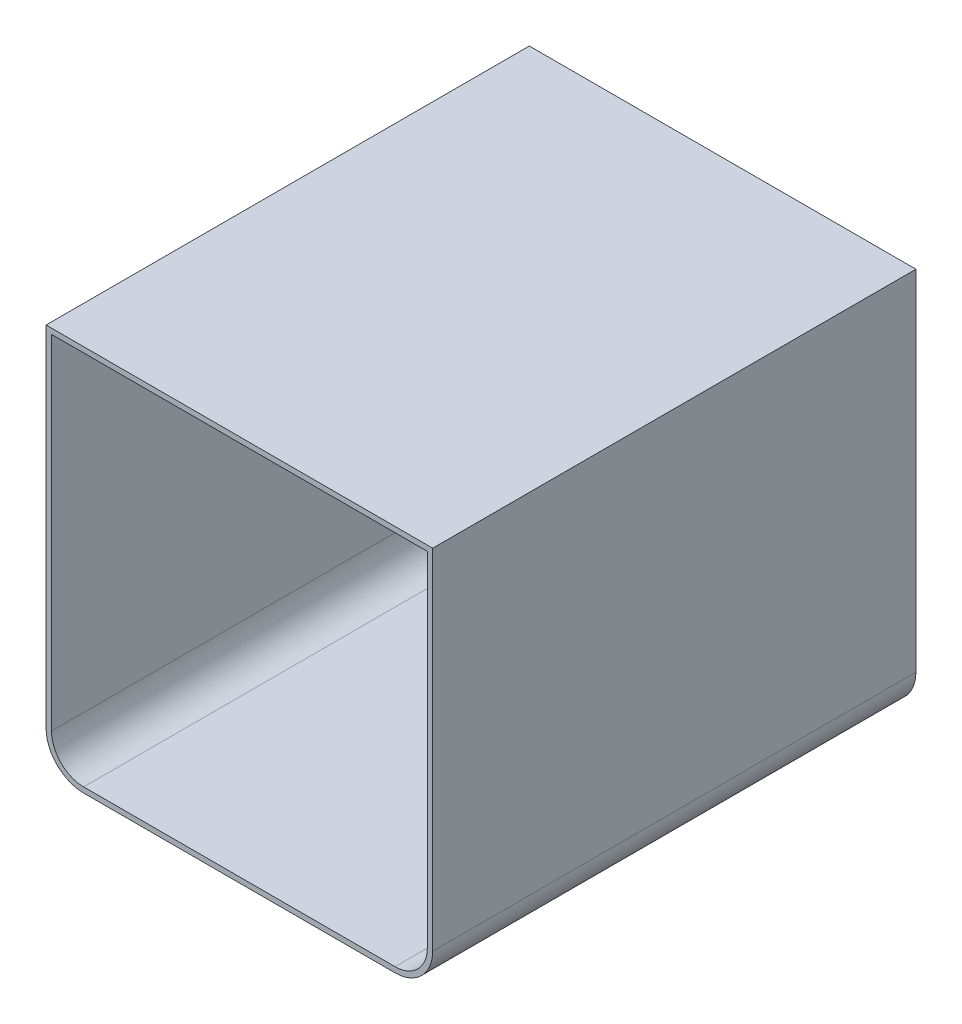
ISO-10303-21;
HEADER;
FILE_DESCRIPTION(('STEP AP214'),'2;1');
FILE_NAME('part.step','',(''),(''),'','','');
FILE_SCHEMA(('AUTOMOTIVE_DESIGN { 1 0 10303 214 1 1 1 1 }'));
ENDSEC;
DATA;
#1=APPLICATION_CONTEXT('core data for automotive mechanical design processes');
#2=APPLICATION_PROTOCOL_DEFINITION('international standard','automotive_design',2000,#1);
#3=PRODUCT_CONTEXT('',#1,'mechanical');
#4=PRODUCT('Part','Part','',(#3));
#5=PRODUCT_RELATED_PRODUCT_CATEGORY('part','',(#4));
#6=PRODUCT_DEFINITION_FORMATION('','',#4);
#7=PRODUCT_DEFINITION_CONTEXT('part definition',#1,'design');
#8=PRODUCT_DEFINITION('design','',#6,#7);
#9=PRODUCT_DEFINITION_SHAPE('','',#8);
#10=(LENGTH_UNIT() NAMED_UNIT(*) SI_UNIT(.MILLI.,.METRE.));
#11=(NAMED_UNIT(*) PLANE_ANGLE_UNIT() SI_UNIT($,.RADIAN.));
#12=(NAMED_UNIT(*) SI_UNIT($,.STERADIAN.) SOLID_ANGLE_UNIT());
#13=UNCERTAINTY_MEASURE_WITH_UNIT(LENGTH_MEASURE(1.E-05),#10,'distance_accuracy_value','');
#14=(GEOMETRIC_REPRESENTATION_CONTEXT(3) GLOBAL_UNCERTAINTY_ASSIGNED_CONTEXT((#13)) GLOBAL_UNIT_ASSIGNED_CONTEXT((#10,
#11,#12)) REPRESENTATION_CONTEXT('',''));
#15=CARTESIAN_POINT('',(0.,0.,0.));
#16=DIRECTION('',(0.,0.,1.));
#17=DIRECTION('',(1.,0.,0.));
#18=AXIS2_PLACEMENT_3D('',#15,#16,#17);
#19=CARTESIAN_POINT('',(-58.,-58.,180.));
#20=DIRECTION('',(0.,0.,-1.));
#21=DIRECTION('',(-1.,0.,0.));
#22=AXIS2_PLACEMENT_3D('',#19,#20,#21);
#23=PLANE('',#22);
#24=DIRECTION('',(0.,1.,0.));
#25=VECTOR('',#24,1.);
#26=CARTESIAN_POINT('',(72.,-57.9999999999999,180.));
#27=LINE('',#26,#25);
#28=CARTESIAN_POINT('',(72.,-58.,180.));
#29=VERTEX_POINT('',#28);
#30=CARTESIAN_POINT('',(72.,72.,180.));
#31=VERTEX_POINT('',#30);
#32=EDGE_CURVE('E177',#29,#31,#27,.T.);
#33=ORIENTED_EDGE('',*,*,#32,.T.);
#34=DIRECTION('',(-1.,0.,0.));
#35=VECTOR('',#34,1.);
#36=CARTESIAN_POINT('',(-72.,72.,180.));
#37=LINE('',#36,#35);
#38=CARTESIAN_POINT('',(-72.,72.,180.));
#39=VERTEX_POINT('',#38);
#40=EDGE_CURVE('E180',#31,#39,#37,.T.);
#41=ORIENTED_EDGE('',*,*,#40,.T.);
#42=DIRECTION('',(0.,-1.,0.));
#43=VECTOR('',#42,1.);
#44=CARTESIAN_POINT('',(-72.,-57.9999999999999,180.));
#45=LINE('',#44,#43);
#46=CARTESIAN_POINT('',(-72.,-57.9999999999999,180.));
#47=VERTEX_POINT('',#46);
#48=EDGE_CURVE('E183',#39,#47,#45,.T.);
#49=ORIENTED_EDGE('',*,*,#48,.T.);
#50=CARTESIAN_POINT('',(-58.,-58.,180.));
#51=DIRECTION('',(0.,0.,1.));
#52=DIRECTION('',(-1.,0.,0.));
#53=AXIS2_PLACEMENT_3D('',#50,#51,#52);
#54=CIRCLE('',#53,14.);
#55=CARTESIAN_POINT('',(-57.9999999999999,-72.,180.));
#56=VERTEX_POINT('',#55);
#57=EDGE_CURVE('E185',#47,#56,#54,.T.);
#58=ORIENTED_EDGE('',*,*,#57,.T.);
#59=DIRECTION('',(1.,0.,0.));
#60=VECTOR('',#59,1.);
#61=CARTESIAN_POINT('',(-57.9999999999999,-72.,180.));
#62=LINE('',#61,#60);
#63=CARTESIAN_POINT('',(57.9999999999999,-72.,180.));
#64=VERTEX_POINT('',#63);
#65=EDGE_CURVE('E187',#56,#64,#62,.T.);
#66=ORIENTED_EDGE('',*,*,#65,.T.);
#67=CARTESIAN_POINT('',(58.,-58.,180.));
#68=DIRECTION('',(0.,0.,1.));
#69=DIRECTION('',(1.,0.,0.));
#70=AXIS2_PLACEMENT_3D('',#67,#68,#69);
#71=CIRCLE('',#70,14.);
#72=EDGE_CURVE('E189',#64,#29,#71,.T.);
#73=ORIENTED_EDGE('',*,*,#72,.T.);
#74=EDGE_LOOP('',(#33,#41,#49,#58,#66,#73));
#75=FACE_BOUND('',#74,.T.);
#76=CARTESIAN_POINT('',(-58.,-58.,180.));
#77=DIRECTION('',(0.,0.,1.));
#78=DIRECTION('',(-1.,0.,0.));
#79=AXIS2_PLACEMENT_3D('',#76,#77,#78);
#80=CIRCLE('',#79,12.);
#81=CARTESIAN_POINT('',(-70.,-57.9999999999999,180.));
#82=VERTEX_POINT('',#81);
#83=CARTESIAN_POINT('',(-57.9999999999999,-70.,180.));
#84=VERTEX_POINT('',#83);
#85=EDGE_CURVE('E126',#82,#84,#80,.T.);
#86=ORIENTED_EDGE('',*,*,#85,.F.);
#87=DIRECTION('',(0.,-1.,0.));
#88=VECTOR('',#87,1.);
#89=CARTESIAN_POINT('',(-70.,-57.9999999999999,180.));
#90=LINE('',#89,#88);
#91=CARTESIAN_POINT('',(-70.,70.,180.));
#92=VERTEX_POINT('',#91);
#93=EDGE_CURVE('E155',#92,#82,#90,.T.);
#94=ORIENTED_EDGE('',*,*,#93,.F.);
#95=DIRECTION('',(-1.,0.,0.));
#96=VECTOR('',#95,1.);
#97=CARTESIAN_POINT('',(-70.,70.,180.));
#98=LINE('',#97,#96);
#99=CARTESIAN_POINT('',(70.,70.,180.));
#100=VERTEX_POINT('',#99);
#101=EDGE_CURVE('E153',#100,#92,#98,.T.);
#102=ORIENTED_EDGE('',*,*,#101,.F.);
#103=DIRECTION('',(0.,1.,0.));
#104=VECTOR('',#103,1.);
#105=CARTESIAN_POINT('',(70.,-57.9999999999999,180.));
#106=LINE('',#105,#104);
#107=CARTESIAN_POINT('',(70.,-57.9999999999999,180.));
#108=VERTEX_POINT('',#107);
#109=EDGE_CURVE('E149',#108,#100,#106,.T.);
#110=ORIENTED_EDGE('',*,*,#109,.F.);
#111=CARTESIAN_POINT('',(58.,-58.,180.));
#112=DIRECTION('',(0.,0.,1.));
#113=DIRECTION('',(1.,0.,0.));
#114=AXIS2_PLACEMENT_3D('',#111,#112,#113);
#115=CIRCLE('',#114,12.);
#116=CARTESIAN_POINT('',(57.9999999999999,-70.,180.));
#117=VERTEX_POINT('',#116);
#118=EDGE_CURVE('E147',#117,#108,#115,.T.);
#119=ORIENTED_EDGE('',*,*,#118,.F.);
#120=DIRECTION('',(1.,0.,0.));
#121=VECTOR('',#120,1.);
#122=CARTESIAN_POINT('',(-57.9999999999999,-70.,180.));
#123=LINE('',#122,#121);
#124=EDGE_CURVE('E134',#84,#117,#123,.T.);
#125=ORIENTED_EDGE('',*,*,#124,.F.);
#126=EDGE_LOOP('',(#86,#94,#102,#110,#119,#125));
#127=FACE_BOUND('',#126,.T.);
#128=ADVANCED_FACE('F37',(#75,#127),#23,.F.);
#129=CARTESIAN_POINT('',(-58.,-58.,0.));
#130=DIRECTION('',(0.,0.,-1.));
#131=DIRECTION('',(-1.,0.,0.));
#132=AXIS2_PLACEMENT_3D('',#129,#130,#131);
#133=PLANE('',#132);
#134=DIRECTION('',(0.,1.,0.));
#135=VECTOR('',#134,1.);
#136=CARTESIAN_POINT('',(72.,-57.9999999999999,0.));
#137=LINE('',#136,#135);
#138=CARTESIAN_POINT('',(72.,-58.,0.));
#139=VERTEX_POINT('',#138);
#140=CARTESIAN_POINT('',(72.,72.,0.));
#141=VERTEX_POINT('',#140);
#142=EDGE_CURVE('E142',#139,#141,#137,.T.);
#143=ORIENTED_EDGE('',*,*,#142,.F.);
#144=CARTESIAN_POINT('',(58.,-58.,0.));
#145=DIRECTION('',(0.,0.,1.));
#146=DIRECTION('',(1.,0.,0.));
#147=AXIS2_PLACEMENT_3D('',#144,#145,#146);
#148=CIRCLE('',#147,14.);
#149=CARTESIAN_POINT('',(57.9999999999999,-72.,0.));
#150=VERTEX_POINT('',#149);
#151=EDGE_CURVE('E181',#150,#139,#148,.T.);
#152=ORIENTED_EDGE('',*,*,#151,.F.);
#153=DIRECTION('',(1.,0.,0.));
#154=VECTOR('',#153,1.);
#155=CARTESIAN_POINT('',(-57.9999999999999,-72.,0.));
#156=LINE('',#155,#154);
#157=CARTESIAN_POINT('',(-57.9999999999999,-72.,0.));
#158=VERTEX_POINT('',#157);
#159=EDGE_CURVE('E200',#158,#150,#156,.T.);
#160=ORIENTED_EDGE('',*,*,#159,.F.);
#161=CARTESIAN_POINT('',(-58.,-58.,0.));
#162=DIRECTION('',(0.,0.,1.));
#163=DIRECTION('',(-1.,0.,0.));
#164=AXIS2_PLACEMENT_3D('',#161,#162,#163);
#165=CIRCLE('',#164,14.);
#166=CARTESIAN_POINT('',(-72.,-57.9999999999999,0.));
#167=VERTEX_POINT('',#166);
#168=EDGE_CURVE('E198',#167,#158,#165,.T.);
#169=ORIENTED_EDGE('',*,*,#168,.F.);
#170=DIRECTION('',(0.,-1.,0.));
#171=VECTOR('',#170,1.);
#172=CARTESIAN_POINT('',(-72.,-57.9999999999999,0.));
#173=LINE('',#172,#171);
#174=CARTESIAN_POINT('',(-72.,72.,0.));
#175=VERTEX_POINT('',#174);
#176=EDGE_CURVE('E196',#175,#167,#173,.T.);
#177=ORIENTED_EDGE('',*,*,#176,.F.);
#178=DIRECTION('',(-1.,0.,0.));
#179=VECTOR('',#178,1.);
#180=CARTESIAN_POINT('',(-72.,72.,0.));
#181=LINE('',#180,#179);
#182=EDGE_CURVE('E194',#141,#175,#181,.T.);
#183=ORIENTED_EDGE('',*,*,#182,.F.);
#184=EDGE_LOOP('',(#143,#152,#160,#169,#177,#183));
#185=FACE_BOUND('',#184,.T.);
#186=DIRECTION('',(0.,-1.,0.));
#187=VECTOR('',#186,1.);
#188=CARTESIAN_POINT('',(-70.,-57.9999999999999,0.));
#189=LINE('',#188,#187);
#190=CARTESIAN_POINT('',(-70.,70.,0.));
#191=VERTEX_POINT('',#190);
#192=CARTESIAN_POINT('',(-70.,-57.9999999999999,0.));
#193=VERTEX_POINT('',#192);
#194=EDGE_CURVE('E135',#191,#193,#189,.T.);
#195=ORIENTED_EDGE('',*,*,#194,.T.);
#196=CARTESIAN_POINT('',(-58.,-58.,0.));
#197=DIRECTION('',(0.,0.,1.));
#198=DIRECTION('',(-1.,0.,0.));
#199=AXIS2_PLACEMENT_3D('',#196,#197,#198);
#200=CIRCLE('',#199,12.);
#201=CARTESIAN_POINT('',(-57.9999999999999,-70.,0.));
#202=VERTEX_POINT('',#201);
#203=EDGE_CURVE('E60',#193,#202,#200,.T.);
#204=ORIENTED_EDGE('',*,*,#203,.T.);
#205=DIRECTION('',(1.,0.,0.));
#206=VECTOR('',#205,1.);
#207=CARTESIAN_POINT('',(-57.9999999999999,-70.,0.));
#208=LINE('',#207,#206);
#209=CARTESIAN_POINT('',(57.9999999999999,-70.,0.));
#210=VERTEX_POINT('',#209);
#211=EDGE_CURVE('E141',#202,#210,#208,.T.);
#212=ORIENTED_EDGE('',*,*,#211,.T.);
#213=CARTESIAN_POINT('',(58.,-58.,0.));
#214=DIRECTION('',(0.,0.,1.));
#215=DIRECTION('',(1.,0.,0.));
#216=AXIS2_PLACEMENT_3D('',#213,#214,#215);
#217=CIRCLE('',#216,12.);
#218=CARTESIAN_POINT('',(70.,-57.9999999999999,0.));
#219=VERTEX_POINT('',#218);
#220=EDGE_CURVE('E159',#210,#219,#217,.T.);
#221=ORIENTED_EDGE('',*,*,#220,.T.);
#222=DIRECTION('',(0.,1.,0.));
#223=VECTOR('',#222,1.);
#224=CARTESIAN_POINT('',(70.,-57.9999999999999,0.));
#225=LINE('',#224,#223);
#226=CARTESIAN_POINT('',(70.,70.,0.));
#227=VERTEX_POINT('',#226);
#228=EDGE_CURVE('E162',#219,#227,#225,.T.);
#229=ORIENTED_EDGE('',*,*,#228,.T.);
#230=DIRECTION('',(-1.,0.,0.));
#231=VECTOR('',#230,1.);
#232=CARTESIAN_POINT('',(-70.,70.,0.));
#233=LINE('',#232,#231);
#234=EDGE_CURVE('E165',#227,#191,#233,.T.);
#235=ORIENTED_EDGE('',*,*,#234,.T.);
#236=EDGE_LOOP('',(#195,#204,#212,#221,#229,#235));
#237=FACE_BOUND('',#236,.T.);
#238=ADVANCED_FACE('F224',(#185,#237),#133,.T.);
#239=CARTESIAN_POINT('',(72.,-57.9999999999999,180.));
#240=DIRECTION('',(-1.,0.,0.));
#241=DIRECTION('',(0.,0.,1.));
#242=AXIS2_PLACEMENT_3D('',#239,#240,#241);
#243=PLANE('',#242);
#244=ORIENTED_EDGE('',*,*,#142,.T.);
#245=DIRECTION('',(0.,0.,-1.));
#246=VECTOR('',#245,1.);
#247=CARTESIAN_POINT('',(72.,72.,180.));
#248=LINE('',#247,#246);
#249=EDGE_CURVE('E11',#31,#141,#248,.T.);
#250=ORIENTED_EDGE('',*,*,#249,.F.);
#251=ORIENTED_EDGE('',*,*,#32,.F.);
#252=DIRECTION('',(0.,0.,-1.));
#253=VECTOR('',#252,1.);
#254=CARTESIAN_POINT('',(72.,-58.,180.));
#255=LINE('',#254,#253);
#256=EDGE_CURVE('E191',#29,#139,#255,.T.);
#257=ORIENTED_EDGE('',*,*,#256,.T.);
#258=EDGE_LOOP('',(#244,#250,#251,#257));
#259=FACE_BOUND('',#258,.T.);
#260=ADVANCED_FACE('F39',(#259),#243,.F.);
#261=CARTESIAN_POINT('',(-72.,72.,180.));
#262=DIRECTION('',(0.,-1.,0.));
#263=DIRECTION('',(0.,0.,-1.));
#264=AXIS2_PLACEMENT_3D('',#261,#262,#263);
#265=PLANE('',#264);
#266=ORIENTED_EDGE('',*,*,#182,.T.);
#267=DIRECTION('',(0.,0.,-1.));
#268=VECTOR('',#267,1.);
#269=CARTESIAN_POINT('',(-72.,72.,180.));
#270=LINE('',#269,#268);
#271=EDGE_CURVE('E45',#39,#175,#270,.T.);
#272=ORIENTED_EDGE('',*,*,#271,.F.);
#273=ORIENTED_EDGE('',*,*,#40,.F.);
#274=ORIENTED_EDGE('',*,*,#249,.T.);
#275=EDGE_LOOP('',(#266,#272,#273,#274));
#276=FACE_BOUND('',#275,.T.);
#277=ADVANCED_FACE('F241',(#276),#265,.F.);
#278=CARTESIAN_POINT('',(-72.,-57.9999999999999,180.));
#279=DIRECTION('',(1.,0.,0.));
#280=DIRECTION('',(0.,0.,-1.));
#281=AXIS2_PLACEMENT_3D('',#278,#279,#280);
#282=PLANE('',#281);
#283=ORIENTED_EDGE('',*,*,#176,.T.);
#284=DIRECTION('',(0.,0.,-1.));
#285=VECTOR('',#284,1.);
#286=CARTESIAN_POINT('',(-72.,-57.9999999999999,180.));
#287=LINE('',#286,#285);
#288=EDGE_CURVE('E211',#47,#167,#287,.T.);
#289=ORIENTED_EDGE('',*,*,#288,.F.);
#290=ORIENTED_EDGE('',*,*,#48,.F.);
#291=ORIENTED_EDGE('',*,*,#271,.T.);
#292=EDGE_LOOP('',(#283,#289,#290,#291));
#293=FACE_BOUND('',#292,.T.);
#294=ADVANCED_FACE('F218',(#293),#282,.F.);
#295=CARTESIAN_POINT('',(-58.,-58.,180.));
#296=DIRECTION('',(0.,0.,-1.));
#297=DIRECTION('',(-1.,0.,0.));
#298=AXIS2_PLACEMENT_3D('',#295,#296,#297);
#299=CYLINDRICAL_SURFACE('',#298,14.);
#300=ORIENTED_EDGE('',*,*,#168,.T.);
#301=DIRECTION('',(0.,0.,-1.));
#302=VECTOR('',#301,1.);
#303=CARTESIAN_POINT('',(-57.9999999999999,-72.,180.));
#304=LINE('',#303,#302);
#305=EDGE_CURVE('E208',#56,#158,#304,.T.);
#306=ORIENTED_EDGE('',*,*,#305,.F.);
#307=ORIENTED_EDGE('',*,*,#57,.F.);
#308=ORIENTED_EDGE('',*,*,#288,.T.);
#309=EDGE_LOOP('',(#300,#306,#307,#308));
#310=FACE_BOUND('',#309,.T.);
#311=ADVANCED_FACE('F230',(#310),#299,.T.);
#312=CARTESIAN_POINT('',(-57.9999999999999,-72.,180.));
#313=DIRECTION('',(0.,1.,0.));
#314=DIRECTION('',(0.,0.,1.));
#315=AXIS2_PLACEMENT_3D('',#312,#313,#314);
#316=PLANE('',#315);
#317=ORIENTED_EDGE('',*,*,#159,.T.);
#318=DIRECTION('',(0.,0.,-1.));
#319=VECTOR('',#318,1.);
#320=CARTESIAN_POINT('',(57.9999999999999,-72.,180.));
#321=LINE('',#320,#319);
#322=EDGE_CURVE('E205',#64,#150,#321,.T.);
#323=ORIENTED_EDGE('',*,*,#322,.F.);
#324=ORIENTED_EDGE('',*,*,#65,.F.);
#325=ORIENTED_EDGE('',*,*,#305,.T.);
#326=EDGE_LOOP('',(#317,#323,#324,#325));
#327=FACE_BOUND('',#326,.T.);
#328=ADVANCED_FACE('F234',(#327),#316,.F.);
#329=CARTESIAN_POINT('',(58.,-58.,180.));
#330=DIRECTION('',(0.,0.,-1.));
#331=DIRECTION('',(-1.,0.,0.));
#332=AXIS2_PLACEMENT_3D('',#329,#330,#331);
#333=CYLINDRICAL_SURFACE('',#332,14.);
#334=ORIENTED_EDGE('',*,*,#151,.T.);
#335=ORIENTED_EDGE('',*,*,#256,.F.);
#336=ORIENTED_EDGE('',*,*,#72,.F.);
#337=ORIENTED_EDGE('',*,*,#322,.T.);
#338=EDGE_LOOP('',(#334,#335,#336,#337));
#339=FACE_BOUND('',#338,.T.);
#340=ADVANCED_FACE('F244',(#339),#333,.T.);
#341=CARTESIAN_POINT('',(-58.,-58.,180.));
#342=DIRECTION('',(0.,0.,-1.));
#343=DIRECTION('',(-1.,0.,0.));
#344=AXIS2_PLACEMENT_3D('',#341,#342,#343);
#345=CYLINDRICAL_SURFACE('',#344,12.);
#346=ORIENTED_EDGE('',*,*,#203,.F.);
#347=DIRECTION('',(0.,0.,-1.));
#348=VECTOR('',#347,1.);
#349=CARTESIAN_POINT('',(-70.,-57.9999999999999,180.));
#350=LINE('',#349,#348);
#351=EDGE_CURVE('E130',#82,#193,#350,.T.);
#352=ORIENTED_EDGE('',*,*,#351,.F.);
#353=ORIENTED_EDGE('',*,*,#85,.T.);
#354=DIRECTION('',(0.,0.,-1.));
#355=VECTOR('',#354,1.);
#356=CARTESIAN_POINT('',(-57.9999999999999,-70.,180.));
#357=LINE('',#356,#355);
#358=EDGE_CURVE('E129',#84,#202,#357,.T.);
#359=ORIENTED_EDGE('',*,*,#358,.T.);
#360=EDGE_LOOP('',(#346,#352,#353,#359));
#361=FACE_BOUND('',#360,.T.);
#362=ADVANCED_FACE('F128',(#361),#345,.F.);
#363=CARTESIAN_POINT('',(-57.9999999999999,-70.,180.));
#364=DIRECTION('',(0.,1.,0.));
#365=DIRECTION('',(0.,0.,1.));
#366=AXIS2_PLACEMENT_3D('',#363,#364,#365);
#367=PLANE('',#366);
#368=ORIENTED_EDGE('',*,*,#211,.F.);
#369=ORIENTED_EDGE('',*,*,#358,.F.);
#370=ORIENTED_EDGE('',*,*,#124,.T.);
#371=DIRECTION('',(0.,0.,-1.));
#372=VECTOR('',#371,1.);
#373=CARTESIAN_POINT('',(57.9999999999999,-70.,180.));
#374=LINE('',#373,#372);
#375=EDGE_CURVE('E143',#117,#210,#374,.T.);
#376=ORIENTED_EDGE('',*,*,#375,.T.);
#377=EDGE_LOOP('',(#368,#369,#370,#376));
#378=FACE_BOUND('',#377,.T.);
#379=ADVANCED_FACE('F138',(#378),#367,.T.);
#380=CARTESIAN_POINT('',(58.,-58.,180.));
#381=DIRECTION('',(0.,0.,-1.));
#382=DIRECTION('',(-1.,0.,0.));
#383=AXIS2_PLACEMENT_3D('',#380,#381,#382);
#384=CYLINDRICAL_SURFACE('',#383,12.);
#385=ORIENTED_EDGE('',*,*,#220,.F.);
#386=ORIENTED_EDGE('',*,*,#375,.F.);
#387=ORIENTED_EDGE('',*,*,#118,.T.);
#388=DIRECTION('',(0.,0.,-1.));
#389=VECTOR('',#388,1.);
#390=CARTESIAN_POINT('',(70.,-57.9999999999999,180.));
#391=LINE('',#390,#389);
#392=EDGE_CURVE('E174',#108,#219,#391,.T.);
#393=ORIENTED_EDGE('',*,*,#392,.T.);
#394=EDGE_LOOP('',(#385,#386,#387,#393));
#395=FACE_BOUND('',#394,.T.);
#396=ADVANCED_FACE('F262',(#395),#384,.F.);
#397=CARTESIAN_POINT('',(70.,-57.9999999999999,180.));
#398=DIRECTION('',(-1.,0.,0.));
#399=DIRECTION('',(0.,0.,1.));
#400=AXIS2_PLACEMENT_3D('',#397,#398,#399);
#401=PLANE('',#400);
#402=ORIENTED_EDGE('',*,*,#228,.F.);
#403=ORIENTED_EDGE('',*,*,#392,.F.);
#404=ORIENTED_EDGE('',*,*,#109,.T.);
#405=DIRECTION('',(0.,0.,-1.));
#406=VECTOR('',#405,1.);
#407=CARTESIAN_POINT('',(70.,70.,180.));
#408=LINE('',#407,#406);
#409=EDGE_CURVE('E172',#100,#227,#408,.T.);
#410=ORIENTED_EDGE('',*,*,#409,.T.);
#411=EDGE_LOOP('',(#402,#403,#404,#410));
#412=FACE_BOUND('',#411,.T.);
#413=ADVANCED_FACE('F265',(#412),#401,.T.);
#414=CARTESIAN_POINT('',(-70.,70.,180.));
#415=DIRECTION('',(0.,-1.,0.));
#416=DIRECTION('',(0.,0.,-1.));
#417=AXIS2_PLACEMENT_3D('',#414,#415,#416);
#418=PLANE('',#417);
#419=ORIENTED_EDGE('',*,*,#234,.F.);
#420=ORIENTED_EDGE('',*,*,#409,.F.);
#421=ORIENTED_EDGE('',*,*,#101,.T.);
#422=DIRECTION('',(0.,0.,-1.));
#423=VECTOR('',#422,1.);
#424=CARTESIAN_POINT('',(-70.,70.,180.));
#425=LINE('',#424,#423);
#426=EDGE_CURVE('E52',#92,#191,#425,.T.);
#427=ORIENTED_EDGE('',*,*,#426,.T.);
#428=EDGE_LOOP('',(#419,#420,#421,#427));
#429=FACE_BOUND('',#428,.T.);
#430=ADVANCED_FACE('F269',(#429),#418,.T.);
#431=CARTESIAN_POINT('',(-70.,-57.9999999999999,180.));
#432=DIRECTION('',(1.,0.,0.));
#433=DIRECTION('',(0.,0.,-1.));
#434=AXIS2_PLACEMENT_3D('',#431,#432,#433);
#435=PLANE('',#434);
#436=ORIENTED_EDGE('',*,*,#194,.F.);
#437=ORIENTED_EDGE('',*,*,#426,.F.);
#438=ORIENTED_EDGE('',*,*,#93,.T.);
#439=ORIENTED_EDGE('',*,*,#351,.T.);
#440=EDGE_LOOP('',(#436,#437,#438,#439));
#441=FACE_BOUND('',#440,.T.);
#442=ADVANCED_FACE('F273',(#441),#435,.T.);
#443=CLOSED_SHELL('',(#128,#238,#260,#277,#294,#311,#328,#340,#362,#379,#396,#413,#430,#442));
#444=MANIFOLD_SOLID_BREP('B2',#443);
#445=ADVANCED_BREP_SHAPE_REPRESENTATION('',(#18,#444),#14);
#446=SHAPE_DEFINITION_REPRESENTATION(#9,#445);
ENDSEC;
END-ISO-10303-21;
